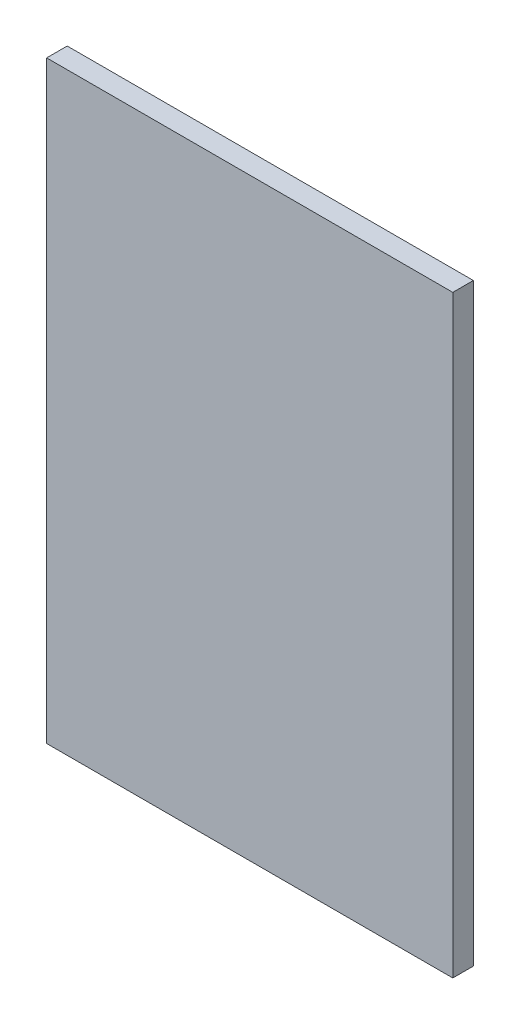
ISO-10303-21;
HEADER;
FILE_DESCRIPTION(('STEP AP214'),'2;1');
FILE_NAME('part.step','',(''),(''),'','','');
FILE_SCHEMA(('AUTOMOTIVE_DESIGN { 1 0 10303 214 1 1 1 1 }'));
ENDSEC;
DATA;
#1=APPLICATION_CONTEXT('core data for automotive mechanical design processes');
#2=APPLICATION_PROTOCOL_DEFINITION('international standard','automotive_design',2000,#1);
#3=PRODUCT_CONTEXT('',#1,'mechanical');
#4=PRODUCT('Part','Part','',(#3));
#5=PRODUCT_RELATED_PRODUCT_CATEGORY('part','',(#4));
#6=PRODUCT_DEFINITION_FORMATION('','',#4);
#7=PRODUCT_DEFINITION_CONTEXT('part definition',#1,'design');
#8=PRODUCT_DEFINITION('design','',#6,#7);
#9=PRODUCT_DEFINITION_SHAPE('','',#8);
#10=(LENGTH_UNIT() NAMED_UNIT(*) SI_UNIT(.MILLI.,.METRE.));
#11=(NAMED_UNIT(*) PLANE_ANGLE_UNIT() SI_UNIT($,.RADIAN.));
#12=(NAMED_UNIT(*) SI_UNIT($,.STERADIAN.) SOLID_ANGLE_UNIT());
#13=UNCERTAINTY_MEASURE_WITH_UNIT(LENGTH_MEASURE(1.E-05),#10,'distance_accuracy_value','');
#14=(GEOMETRIC_REPRESENTATION_CONTEXT(3) GLOBAL_UNCERTAINTY_ASSIGNED_CONTEXT((#13)) GLOBAL_UNIT_ASSIGNED_CONTEXT((#10,
#11,#12)) REPRESENTATION_CONTEXT('',''));
#15=CARTESIAN_POINT('',(0.,0.,0.));
#16=DIRECTION('',(0.,0.,1.));
#17=DIRECTION('',(1.,0.,0.));
#18=AXIS2_PLACEMENT_3D('',#15,#16,#17);
#19=CARTESIAN_POINT('',(125.4125,-183.3626,6.35));
#20=DIRECTION('',(-1.,0.,0.));
#21=DIRECTION('',(0.,0.,1.));
#22=AXIS2_PLACEMENT_3D('',#19,#20,#21);
#23=PLANE('',#22);
#24=DIRECTION('',(0.,1.,0.));
#25=VECTOR('',#24,1.);
#26=CARTESIAN_POINT('',(125.4125,-183.3626,-6.35));
#27=LINE('',#26,#25);
#28=CARTESIAN_POINT('',(125.4125,-183.3626,-6.35));
#29=VERTEX_POINT('',#28);
#30=CARTESIAN_POINT('',(125.4125,183.3626,-6.35));
#31=VERTEX_POINT('',#30);
#32=EDGE_CURVE('E96',#29,#31,#27,.T.);
#33=ORIENTED_EDGE('',*,*,#32,.T.);
#34=DIRECTION('',(0.,0.,-1.));
#35=VECTOR('',#34,1.);
#36=CARTESIAN_POINT('',(125.4125,183.3626,6.35));
#37=LINE('',#36,#35);
#38=CARTESIAN_POINT('',(125.4125,183.3626,6.35));
#39=VERTEX_POINT('',#38);
#40=EDGE_CURVE('E11',#39,#31,#37,.T.);
#41=ORIENTED_EDGE('',*,*,#40,.F.);
#42=DIRECTION('',(0.,1.,0.));
#43=VECTOR('',#42,1.);
#44=CARTESIAN_POINT('',(125.4125,-183.3626,6.35));
#45=LINE('',#44,#43);
#46=CARTESIAN_POINT('',(125.4125,-183.3626,6.35));
#47=VERTEX_POINT('',#46);
#48=EDGE_CURVE('E84',#47,#39,#45,.T.);
#49=ORIENTED_EDGE('',*,*,#48,.F.);
#50=DIRECTION('',(0.,0.,-1.));
#51=VECTOR('',#50,1.);
#52=CARTESIAN_POINT('',(125.4125,-183.3626,6.35));
#53=LINE('',#52,#51);
#54=EDGE_CURVE('E92',#47,#29,#53,.T.);
#55=ORIENTED_EDGE('',*,*,#54,.T.);
#56=EDGE_LOOP('',(#33,#41,#49,#55));
#57=FACE_BOUND('',#56,.T.);
#58=ADVANCED_FACE('F33',(#57),#23,.F.);
#59=CARTESIAN_POINT('',(-125.4125,183.3626,6.35));
#60=DIRECTION('',(0.,-1.,0.));
#61=DIRECTION('',(0.,0.,-1.));
#62=AXIS2_PLACEMENT_3D('',#59,#60,#61);
#63=PLANE('',#62);
#64=DIRECTION('',(-1.,0.,0.));
#65=VECTOR('',#64,1.);
#66=CARTESIAN_POINT('',(-125.4125,183.3626,-6.35));
#67=LINE('',#66,#65);
#68=CARTESIAN_POINT('',(-125.4125,183.3626,-6.35));
#69=VERTEX_POINT('',#68);
#70=EDGE_CURVE('E88',#31,#69,#67,.T.);
#71=ORIENTED_EDGE('',*,*,#70,.T.);
#72=DIRECTION('',(0.,0.,-1.));
#73=VECTOR('',#72,1.);
#74=CARTESIAN_POINT('',(-125.4125,183.3626,6.35));
#75=LINE('',#74,#73);
#76=CARTESIAN_POINT('',(-125.4125,183.3626,6.35));
#77=VERTEX_POINT('',#76);
#78=EDGE_CURVE('E41',#77,#69,#75,.T.);
#79=ORIENTED_EDGE('',*,*,#78,.F.);
#80=DIRECTION('',(-1.,0.,0.));
#81=VECTOR('',#80,1.);
#82=CARTESIAN_POINT('',(-125.4125,183.3626,6.35));
#83=LINE('',#82,#81);
#84=EDGE_CURVE('E79',#39,#77,#83,.T.);
#85=ORIENTED_EDGE('',*,*,#84,.F.);
#86=ORIENTED_EDGE('',*,*,#40,.T.);
#87=EDGE_LOOP('',(#71,#79,#85,#86));
#88=FACE_BOUND('',#87,.T.);
#89=ADVANCED_FACE('F87',(#88),#63,.F.);
#90=CARTESIAN_POINT('',(-125.4125,-183.3626,6.35));
#91=DIRECTION('',(1.,0.,0.));
#92=DIRECTION('',(0.,0.,-1.));
#93=AXIS2_PLACEMENT_3D('',#90,#91,#92);
#94=PLANE('',#93);
#95=DIRECTION('',(0.,-1.,0.));
#96=VECTOR('',#95,1.);
#97=CARTESIAN_POINT('',(-125.4125,-183.3626,-6.35));
#98=LINE('',#97,#96);
#99=CARTESIAN_POINT('',(-125.4125,-183.3626,-6.35));
#100=VERTEX_POINT('',#99);
#101=EDGE_CURVE('E66',#69,#100,#98,.T.);
#102=ORIENTED_EDGE('',*,*,#101,.T.);
#103=DIRECTION('',(0.,0.,-1.));
#104=VECTOR('',#103,1.);
#105=CARTESIAN_POINT('',(-125.4125,-183.3626,6.35));
#106=LINE('',#105,#104);
#107=CARTESIAN_POINT('',(-125.4125,-183.3626,6.35));
#108=VERTEX_POINT('',#107);
#109=EDGE_CURVE('E89',#108,#100,#106,.T.);
#110=ORIENTED_EDGE('',*,*,#109,.F.);
#111=DIRECTION('',(0.,-1.,0.));
#112=VECTOR('',#111,1.);
#113=CARTESIAN_POINT('',(-125.4125,-183.3626,6.35));
#114=LINE('',#113,#112);
#115=EDGE_CURVE('E82',#77,#108,#114,.T.);
#116=ORIENTED_EDGE('',*,*,#115,.F.);
#117=ORIENTED_EDGE('',*,*,#78,.T.);
#118=EDGE_LOOP('',(#102,#110,#116,#117));
#119=FACE_BOUND('',#118,.T.);
#120=ADVANCED_FACE('F90',(#119),#94,.F.);
#121=CARTESIAN_POINT('',(-125.4125,-183.3626,6.35));
#122=DIRECTION('',(0.,1.,0.));
#123=DIRECTION('',(0.,0.,1.));
#124=AXIS2_PLACEMENT_3D('',#121,#122,#123);
#125=PLANE('',#124);
#126=DIRECTION('',(1.,0.,0.));
#127=VECTOR('',#126,1.);
#128=CARTESIAN_POINT('',(-125.4125,-183.3626,-6.35));
#129=LINE('',#128,#127);
#130=EDGE_CURVE('E72',#100,#29,#129,.T.);
#131=ORIENTED_EDGE('',*,*,#130,.T.);
#132=ORIENTED_EDGE('',*,*,#54,.F.);
#133=DIRECTION('',(1.,0.,0.));
#134=VECTOR('',#133,1.);
#135=CARTESIAN_POINT('',(-125.4125,-183.3626,6.35));
#136=LINE('',#135,#134);
#137=EDGE_CURVE('E49',#108,#47,#136,.T.);
#138=ORIENTED_EDGE('',*,*,#137,.F.);
#139=ORIENTED_EDGE('',*,*,#109,.T.);
#140=EDGE_LOOP('',(#131,#132,#138,#139));
#141=FACE_BOUND('',#140,.T.);
#142=ADVANCED_FACE('F103',(#141),#125,.F.);
#143=CARTESIAN_POINT('',(0.,0.,6.35));
#144=DIRECTION('',(0.,0.,-1.));
#145=DIRECTION('',(-1.,0.,0.));
#146=AXIS2_PLACEMENT_3D('',#143,#144,#145);
#147=PLANE('',#146);
#148=ORIENTED_EDGE('',*,*,#48,.T.);
#149=ORIENTED_EDGE('',*,*,#84,.T.);
#150=ORIENTED_EDGE('',*,*,#115,.T.);
#151=ORIENTED_EDGE('',*,*,#137,.T.);
#152=EDGE_LOOP('',(#148,#149,#150,#151));
#153=FACE_BOUND('',#152,.T.);
#154=ADVANCED_FACE('F80',(#153),#147,.F.);
#155=CARTESIAN_POINT('',(0.,0.,-6.35));
#156=DIRECTION('',(0.,0.,-1.));
#157=DIRECTION('',(-1.,0.,0.));
#158=AXIS2_PLACEMENT_3D('',#155,#156,#157);
#159=PLANE('',#158);
#160=ORIENTED_EDGE('',*,*,#32,.F.);
#161=ORIENTED_EDGE('',*,*,#130,.F.);
#162=ORIENTED_EDGE('',*,*,#101,.F.);
#163=ORIENTED_EDGE('',*,*,#70,.F.);
#164=EDGE_LOOP('',(#160,#161,#162,#163));
#165=FACE_BOUND('',#164,.T.);
#166=ADVANCED_FACE('F106',(#165),#159,.T.);
#167=CLOSED_SHELL('',(#58,#89,#120,#142,#154,#166));
#168=MANIFOLD_SOLID_BREP('B2',#167);
#169=ADVANCED_BREP_SHAPE_REPRESENTATION('',(#18,#168),#14);
#170=SHAPE_DEFINITION_REPRESENTATION(#9,#169);
ENDSEC;
END-ISO-10303-21;
